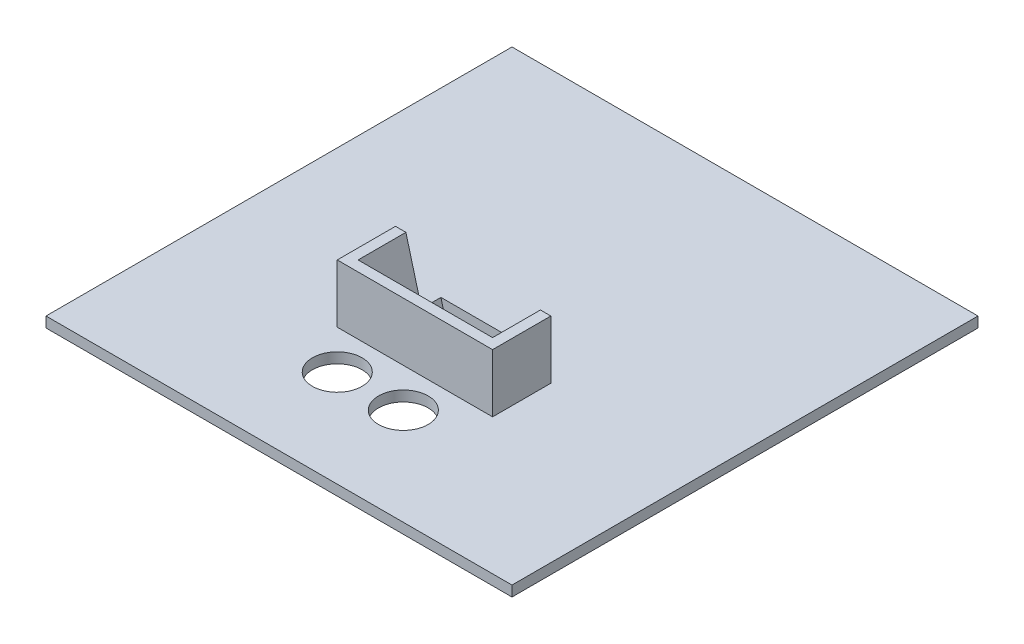
ISO-10303-21;
HEADER;
FILE_DESCRIPTION(('STEP AP214'),'2;1');
FILE_NAME('part.step','',(''),(''),'','','');
FILE_SCHEMA(('AUTOMOTIVE_DESIGN { 1 0 10303 214 1 1 1 1 }'));
ENDSEC;
DATA;
#1=APPLICATION_CONTEXT('core data for automotive mechanical design processes');
#2=APPLICATION_PROTOCOL_DEFINITION('international standard','automotive_design',2000,#1);
#3=PRODUCT_CONTEXT('',#1,'mechanical');
#4=PRODUCT('Part','Part','',(#3));
#5=PRODUCT_RELATED_PRODUCT_CATEGORY('part','',(#4));
#6=PRODUCT_DEFINITION_FORMATION('','',#4);
#7=PRODUCT_DEFINITION_CONTEXT('part definition',#1,'design');
#8=PRODUCT_DEFINITION('design','',#6,#7);
#9=PRODUCT_DEFINITION_SHAPE('','',#8);
#10=(LENGTH_UNIT() NAMED_UNIT(*) SI_UNIT(.MILLI.,.METRE.));
#11=(NAMED_UNIT(*) PLANE_ANGLE_UNIT() SI_UNIT($,.RADIAN.));
#12=(NAMED_UNIT(*) SI_UNIT($,.STERADIAN.) SOLID_ANGLE_UNIT());
#13=UNCERTAINTY_MEASURE_WITH_UNIT(LENGTH_MEASURE(1.E-05),#10,'distance_accuracy_value','');
#14=(GEOMETRIC_REPRESENTATION_CONTEXT(3) GLOBAL_UNCERTAINTY_ASSIGNED_CONTEXT((#13)) GLOBAL_UNIT_ASSIGNED_CONTEXT((#10,
#11,#12)) REPRESENTATION_CONTEXT('',''));
#15=CARTESIAN_POINT('',(0.,0.,0.));
#16=DIRECTION('',(0.,0.,1.));
#17=DIRECTION('',(1.,0.,0.));
#18=AXIS2_PLACEMENT_3D('',#15,#16,#17);
#19=CARTESIAN_POINT('',(50.8,22.4536,-63.5));
#20=DIRECTION('',(0.,0.,1.));
#21=DIRECTION('',(1.,0.,0.));
#22=AXIS2_PLACEMENT_3D('',#19,#20,#21);
#23=PLANE('',#22);
#24=DIRECTION('',(-1.,0.,0.));
#25=VECTOR('',#24,1.);
#26=CARTESIAN_POINT('',(50.8,22.4536,-63.5));
#27=LINE('',#26,#25);
#28=CARTESIAN_POINT('',(54.2036,22.4536,-63.5));
#29=VERTEX_POINT('',#28);
#30=CARTESIAN_POINT('',(50.8,22.4536,-63.5));
#31=VERTEX_POINT('',#30);
#32=EDGE_CURVE('E211',#29,#31,#27,.T.);
#33=ORIENTED_EDGE('',*,*,#32,.F.);
#34=DIRECTION('',(-0.258819045102521,0.965925826289068,0.));
#35=VECTOR('',#34,1.);
#36=CARTESIAN_POINT('',(53.9756020321603,23.3045,-63.5));
#37=LINE('',#36,#35);
#38=CARTESIAN_POINT('',(59.3080321158129,3.4036,-63.5));
#39=VERTEX_POINT('',#38);
#40=EDGE_CURVE('E176',#29,#39,#37,.F.);
#41=ORIENTED_EDGE('',*,*,#40,.T.);
#42=DIRECTION('',(-1.,0.,0.));
#43=VECTOR('',#42,1.);
#44=CARTESIAN_POINT('',(50.8,3.4036,-63.5));
#45=LINE('',#44,#43);
#46=CARTESIAN_POINT('',(50.8,3.4036,-63.5));
#47=VERTEX_POINT('',#46);
#48=EDGE_CURVE('E174',#39,#47,#45,.T.);
#49=ORIENTED_EDGE('',*,*,#48,.T.);
#50=DIRECTION('',(0.,-1.,0.));
#51=VECTOR('',#50,1.);
#52=CARTESIAN_POINT('',(50.8,22.4536,-63.5));
#53=LINE('',#52,#51);
#54=EDGE_CURVE('E210',#31,#47,#53,.T.);
#55=ORIENTED_EDGE('',*,*,#54,.F.);
#56=EDGE_LOOP('',(#33,#41,#49,#55));
#57=FACE_BOUND('',#56,.T.);
#58=ADVANCED_FACE('F45',(#57),#23,.F.);
#59=CARTESIAN_POINT('',(0.,3.4036,0.));
#60=DIRECTION('',(0.,-1.,0.));
#61=DIRECTION('',(0.,0.,-1.));
#62=AXIS2_PLACEMENT_3D('',#59,#60,#61);
#63=PLANE('',#62);
#64=DIRECTION('',(0.,0.,1.));
#65=VECTOR('',#64,1.);
#66=CARTESIAN_POINT('',(0.,3.4036,0.));
#67=LINE('',#66,#65);
#68=CARTESIAN_POINT('',(0.,3.4036,-152.4));
#69=VERTEX_POINT('',#68);
#70=CARTESIAN_POINT('',(0.,3.4036,0.));
#71=VERTEX_POINT('',#70);
#72=EDGE_CURVE('E262',#69,#71,#67,.T.);
#73=ORIENTED_EDGE('',*,*,#72,.T.);
#74=DIRECTION('',(1.,0.,0.));
#75=VECTOR('',#74,1.);
#76=CARTESIAN_POINT('',(0.,3.4036,0.));
#77=LINE('',#76,#75);
#78=CARTESIAN_POINT('',(152.4,3.4036,0.));
#79=VERTEX_POINT('',#78);
#80=EDGE_CURVE('E266',#71,#79,#77,.T.);
#81=ORIENTED_EDGE('',*,*,#80,.T.);
#82=DIRECTION('',(0.,0.,-1.));
#83=VECTOR('',#82,1.);
#84=CARTESIAN_POINT('',(152.4,3.4036,0.));
#85=LINE('',#84,#83);
#86=CARTESIAN_POINT('',(152.4,3.4036,-152.4));
#87=VERTEX_POINT('',#86);
#88=EDGE_CURVE('E270',#79,#87,#85,.T.);
#89=ORIENTED_EDGE('',*,*,#88,.T.);
#90=DIRECTION('',(-1.,0.,0.));
#91=VECTOR('',#90,1.);
#92=CARTESIAN_POINT('',(0.,3.4036,-152.4));
#93=LINE('',#92,#91);
#94=EDGE_CURVE('E273',#87,#69,#93,.T.);
#95=ORIENTED_EDGE('',*,*,#94,.T.);
#96=EDGE_LOOP('',(#73,#81,#89,#95));
#97=FACE_BOUND('',#96,.T.);
#98=CARTESIAN_POINT('',(85.1154,3.4036,-31.75));
#99=DIRECTION('',(0.,1.,0.));
#100=DIRECTION('',(0.,0.,1.));
#101=AXIS2_PLACEMENT_3D('',#98,#99,#100);
#102=CIRCLE('',#101,8.10895);
#103=CARTESIAN_POINT('',(85.1154,3.4036,-23.64105));
#104=VERTEX_POINT('',#103);
#105=EDGE_CURVE('E255',#104,#104,#102,.T.);
#106=ORIENTED_EDGE('',*,*,#105,.F.);
#107=EDGE_LOOP('',(#106));
#108=FACE_BOUND('',#107,.T.);
#109=CARTESIAN_POINT('',(63.5,3.4036,-31.75));
#110=DIRECTION('',(0.,1.,0.));
#111=DIRECTION('',(0.,0.,1.));
#112=AXIS2_PLACEMENT_3D('',#109,#110,#111);
#113=CIRCLE('',#112,8.10895);
#114=CARTESIAN_POINT('',(63.5,3.4036,-23.64105));
#115=VERTEX_POINT('',#114);
#116=EDGE_CURVE('E251',#115,#115,#113,.T.);
#117=ORIENTED_EDGE('',*,*,#116,.F.);
#118=EDGE_LOOP('',(#117));
#119=FACE_BOUND('',#118,.T.);
#120=ORIENTED_EDGE('',*,*,#48,.F.);
#121=DIRECTION('',(0.,0.,1.));
#122=VECTOR('',#121,1.);
#123=CARTESIAN_POINT('',(59.3080321158129,3.4036,0.));
#124=LINE('',#123,#122);
#125=CARTESIAN_POINT('',(59.3080321158129,3.4036,-69.85));
#126=VERTEX_POINT('',#125);
#127=EDGE_CURVE('E160',#39,#126,#124,.F.);
#128=ORIENTED_EDGE('',*,*,#127,.T.);
#129=DIRECTION('',(1.,0.,0.));
#130=VECTOR('',#129,1.);
#131=CARTESIAN_POINT('',(0.,3.4036,-69.85));
#132=LINE('',#131,#130);
#133=CARTESIAN_POINT('',(93.0919678841871,3.4036,-69.85));
#134=VERTEX_POINT('',#133);
#135=EDGE_CURVE('E149',#126,#134,#132,.T.);
#136=ORIENTED_EDGE('',*,*,#135,.T.);
#137=DIRECTION('',(0.,0.,-1.));
#138=VECTOR('',#137,1.);
#139=CARTESIAN_POINT('',(93.0919678841871,3.4036,0.));
#140=LINE('',#139,#138);
#141=CARTESIAN_POINT('',(93.0919678841871,3.4036,-63.5));
#142=VERTEX_POINT('',#141);
#143=EDGE_CURVE('E81',#134,#142,#140,.F.);
#144=ORIENTED_EDGE('',*,*,#143,.T.);
#145=CARTESIAN_POINT('',(101.6,3.4036,-63.5));
#146=VERTEX_POINT('',#145);
#147=EDGE_CURVE('E202',#146,#142,#45,.T.);
#148=ORIENTED_EDGE('',*,*,#147,.F.);
#149=DIRECTION('',(0.,0.,-1.));
#150=VECTOR('',#149,1.);
#151=CARTESIAN_POINT('',(101.6,3.4036,-44.45));
#152=LINE('',#151,#150);
#153=CARTESIAN_POINT('',(101.6,3.4036,-44.45));
#154=VERTEX_POINT('',#153);
#155=EDGE_CURVE('E228',#154,#146,#152,.T.);
#156=ORIENTED_EDGE('',*,*,#155,.F.);
#157=DIRECTION('',(1.,0.,0.));
#158=VECTOR('',#157,1.);
#159=CARTESIAN_POINT('',(50.8,3.4036,-44.45));
#160=LINE('',#159,#158);
#161=CARTESIAN_POINT('',(50.8,3.4036,-44.45));
#162=VERTEX_POINT('',#161);
#163=EDGE_CURVE('E224',#162,#154,#160,.T.);
#164=ORIENTED_EDGE('',*,*,#163,.F.);
#165=DIRECTION('',(0.,0.,1.));
#166=VECTOR('',#165,1.);
#167=CARTESIAN_POINT('',(50.8,3.4036,-44.45));
#168=LINE('',#167,#166);
#169=EDGE_CURVE('E159',#47,#162,#168,.T.);
#170=ORIENTED_EDGE('',*,*,#169,.F.);
#171=EDGE_LOOP('',(#120,#128,#136,#144,#148,#156,#164,#170));
#172=FACE_BOUND('',#171,.T.);
#173=ADVANCED_FACE('F172',(#97,#108,#119,#172),#63,.F.);
#174=CARTESIAN_POINT('',(0.,3.4036,0.));
#175=DIRECTION('',(1.,0.,0.));
#176=DIRECTION('',(0.,0.,-1.));
#177=AXIS2_PLACEMENT_3D('',#174,#175,#176);
#178=PLANE('',#177);
#179=DIRECTION('',(0.,0.,1.));
#180=VECTOR('',#179,1.);
#181=CARTESIAN_POINT('',(0.,0.,0.));
#182=LINE('',#181,#180);
#183=CARTESIAN_POINT('',(0.,0.,-152.4));
#184=VERTEX_POINT('',#183);
#185=CARTESIAN_POINT('',(0.,0.,0.));
#186=VERTEX_POINT('',#185);
#187=EDGE_CURVE('E250',#184,#186,#182,.T.);
#188=ORIENTED_EDGE('',*,*,#187,.T.);
#189=DIRECTION('',(0.,-1.,0.));
#190=VECTOR('',#189,1.);
#191=CARTESIAN_POINT('',(0.,3.4036,0.));
#192=LINE('',#191,#190);
#193=EDGE_CURVE('E56',#71,#186,#192,.T.);
#194=ORIENTED_EDGE('',*,*,#193,.F.);
#195=ORIENTED_EDGE('',*,*,#72,.F.);
#196=DIRECTION('',(0.,-1.,0.));
#197=VECTOR('',#196,1.);
#198=CARTESIAN_POINT('',(0.,3.4036,-152.4));
#199=LINE('',#198,#197);
#200=EDGE_CURVE('E276',#69,#184,#199,.T.);
#201=ORIENTED_EDGE('',*,*,#200,.T.);
#202=EDGE_LOOP('',(#188,#194,#195,#201));
#203=FACE_BOUND('',#202,.T.);
#204=ADVANCED_FACE('F352',(#203),#178,.F.);
#205=CARTESIAN_POINT('',(0.,3.4036,0.));
#206=DIRECTION('',(0.,0.,-1.));
#207=DIRECTION('',(-1.,0.,0.));
#208=AXIS2_PLACEMENT_3D('',#205,#206,#207);
#209=PLANE('',#208);
#210=DIRECTION('',(1.,0.,0.));
#211=VECTOR('',#210,1.);
#212=CARTESIAN_POINT('',(0.,0.,0.));
#213=LINE('',#212,#211);
#214=CARTESIAN_POINT('',(152.4,0.,0.));
#215=VERTEX_POINT('',#214);
#216=EDGE_CURVE('E280',#186,#215,#213,.T.);
#217=ORIENTED_EDGE('',*,*,#216,.T.);
#218=DIRECTION('',(0.,-1.,0.));
#219=VECTOR('',#218,1.);
#220=CARTESIAN_POINT('',(152.4,3.4036,0.));
#221=LINE('',#220,#219);
#222=EDGE_CURVE('E295',#79,#215,#221,.T.);
#223=ORIENTED_EDGE('',*,*,#222,.F.);
#224=ORIENTED_EDGE('',*,*,#80,.F.);
#225=ORIENTED_EDGE('',*,*,#193,.T.);
#226=EDGE_LOOP('',(#217,#223,#224,#225));
#227=FACE_BOUND('',#226,.T.);
#228=ADVANCED_FACE('F363',(#227),#209,.F.);
#229=CARTESIAN_POINT('',(152.4,3.4036,0.));
#230=DIRECTION('',(-1.,0.,0.));
#231=DIRECTION('',(0.,0.,1.));
#232=AXIS2_PLACEMENT_3D('',#229,#230,#231);
#233=PLANE('',#232);
#234=DIRECTION('',(0.,0.,-1.));
#235=VECTOR('',#234,1.);
#236=CARTESIAN_POINT('',(152.4,0.,0.));
#237=LINE('',#236,#235);
#238=CARTESIAN_POINT('',(152.4,0.,-152.4));
#239=VERTEX_POINT('',#238);
#240=EDGE_CURVE('E283',#215,#239,#237,.T.);
#241=ORIENTED_EDGE('',*,*,#240,.T.);
#242=DIRECTION('',(0.,-1.,0.));
#243=VECTOR('',#242,1.);
#244=CARTESIAN_POINT('',(152.4,3.4036,-152.4));
#245=LINE('',#244,#243);
#246=EDGE_CURVE('E291',#87,#239,#245,.T.);
#247=ORIENTED_EDGE('',*,*,#246,.F.);
#248=ORIENTED_EDGE('',*,*,#88,.F.);
#249=ORIENTED_EDGE('',*,*,#222,.T.);
#250=EDGE_LOOP('',(#241,#247,#248,#249));
#251=FACE_BOUND('',#250,.T.);
#252=ADVANCED_FACE('F360',(#251),#233,.F.);
#253=CARTESIAN_POINT('',(0.,3.4036,-152.4));
#254=DIRECTION('',(0.,0.,1.));
#255=DIRECTION('',(1.,0.,0.));
#256=AXIS2_PLACEMENT_3D('',#253,#254,#255);
#257=PLANE('',#256);
#258=DIRECTION('',(-1.,0.,0.));
#259=VECTOR('',#258,1.);
#260=CARTESIAN_POINT('',(0.,0.,-152.4));
#261=LINE('',#260,#259);
#262=EDGE_CURVE('E267',#239,#184,#261,.T.);
#263=ORIENTED_EDGE('',*,*,#262,.T.);
#264=ORIENTED_EDGE('',*,*,#200,.F.);
#265=ORIENTED_EDGE('',*,*,#94,.F.);
#266=ORIENTED_EDGE('',*,*,#246,.T.);
#267=EDGE_LOOP('',(#263,#264,#265,#266));
#268=FACE_BOUND('',#267,.T.);
#269=ADVANCED_FACE('F341',(#268),#257,.F.);
#270=CARTESIAN_POINT('',(0.,0.,0.));
#271=DIRECTION('',(0.,-1.,0.));
#272=DIRECTION('',(0.,0.,-1.));
#273=AXIS2_PLACEMENT_3D('',#270,#271,#272);
#274=PLANE('',#273);
#275=DIRECTION('',(0.,0.,-1.));
#276=VECTOR('',#275,1.);
#277=CARTESIAN_POINT('',(60.2200239871714,0.,0.));
#278=LINE('',#277,#276);
#279=CARTESIAN_POINT('',(60.2200239871714,0.,-69.85));
#280=VERTEX_POINT('',#279);
#281=CARTESIAN_POINT('',(60.2200239871714,0.,-53.8700239871715));
#282=VERTEX_POINT('',#281);
#283=EDGE_CURVE('E167',#280,#282,#278,.F.);
#284=ORIENTED_EDGE('',*,*,#283,.T.);
#285=DIRECTION('',(-1.,0.,0.));
#286=VECTOR('',#285,1.);
#287=CARTESIAN_POINT('',(54.2036,0.,-53.8700239871715));
#288=LINE('',#287,#286);
#289=CARTESIAN_POINT('',(92.1799760128286,0.,-53.8700239871715));
#290=VERTEX_POINT('',#289);
#291=EDGE_CURVE('E184',#282,#290,#288,.F.);
#292=ORIENTED_EDGE('',*,*,#291,.T.);
#293=DIRECTION('',(0.,0.,1.));
#294=VECTOR('',#293,1.);
#295=CARTESIAN_POINT('',(92.1799760128286,0.,-47.8536));
#296=LINE('',#295,#294);
#297=CARTESIAN_POINT('',(92.1799760128286,0.,-69.85));
#298=VERTEX_POINT('',#297);
#299=EDGE_CURVE('E65',#290,#298,#296,.F.);
#300=ORIENTED_EDGE('',*,*,#299,.T.);
#301=DIRECTION('',(-1.,0.,0.));
#302=VECTOR('',#301,1.);
#303=CARTESIAN_POINT('',(54.2036,0.,-69.85));
#304=LINE('',#303,#302);
#305=EDGE_CURVE('E190',#298,#280,#304,.T.);
#306=ORIENTED_EDGE('',*,*,#305,.T.);
#307=EDGE_LOOP('',(#284,#292,#300,#306));
#308=FACE_BOUND('',#307,.T.);
#309=CARTESIAN_POINT('',(63.5,0.,-31.75));
#310=DIRECTION('',(0.,1.,0.));
#311=DIRECTION('',(0.,0.,1.));
#312=AXIS2_PLACEMENT_3D('',#309,#310,#311);
#313=CIRCLE('',#312,8.10895);
#314=CARTESIAN_POINT('',(63.5,0.,-23.64105));
#315=VERTEX_POINT('',#314);
#316=EDGE_CURVE('E246',#315,#315,#313,.T.);
#317=ORIENTED_EDGE('',*,*,#316,.T.);
#318=EDGE_LOOP('',(#317));
#319=FACE_BOUND('',#318,.T.);
#320=CARTESIAN_POINT('',(85.1154,0.,-31.75));
#321=DIRECTION('',(0.,1.,0.));
#322=DIRECTION('',(0.,0.,1.));
#323=AXIS2_PLACEMENT_3D('',#320,#321,#322);
#324=CIRCLE('',#323,8.10895);
#325=CARTESIAN_POINT('',(85.1154,0.,-23.64105));
#326=VERTEX_POINT('',#325);
#327=EDGE_CURVE('E245',#326,#326,#324,.T.);
#328=ORIENTED_EDGE('',*,*,#327,.T.);
#329=EDGE_LOOP('',(#328));
#330=FACE_BOUND('',#329,.T.);
#331=ORIENTED_EDGE('',*,*,#187,.F.);
#332=ORIENTED_EDGE('',*,*,#262,.F.);
#333=ORIENTED_EDGE('',*,*,#240,.F.);
#334=ORIENTED_EDGE('',*,*,#216,.F.);
#335=EDGE_LOOP('',(#331,#332,#333,#334));
#336=FACE_BOUND('',#335,.T.);
#337=ADVANCED_FACE('F336',(#308,#319,#330,#336),#274,.T.);
#338=CARTESIAN_POINT('',(85.1154,0.,-31.75));
#339=DIRECTION('',(0.,1.,0.));
#340=DIRECTION('',(0.,0.,1.));
#341=AXIS2_PLACEMENT_3D('',#338,#339,#340);
#342=CYLINDRICAL_SURFACE('',#341,8.10895);
#343=ORIENTED_EDGE('',*,*,#327,.F.);
#344=EDGE_LOOP('',(#343));
#345=FACE_BOUND('',#344,.T.);
#346=ORIENTED_EDGE('',*,*,#105,.T.);
#347=EDGE_LOOP('',(#346));
#348=FACE_BOUND('',#347,.T.);
#349=ADVANCED_FACE('F340',(#345,#348),#342,.F.);
#350=CARTESIAN_POINT('',(63.5,0.,-31.75));
#351=DIRECTION('',(0.,1.,0.));
#352=DIRECTION('',(0.,0.,1.));
#353=AXIS2_PLACEMENT_3D('',#350,#351,#352);
#354=CYLINDRICAL_SURFACE('',#353,8.10895);
#355=ORIENTED_EDGE('',*,*,#316,.F.);
#356=EDGE_LOOP('',(#355));
#357=FACE_BOUND('',#356,.T.);
#358=ORIENTED_EDGE('',*,*,#116,.T.);
#359=EDGE_LOOP('',(#358));
#360=FACE_BOUND('',#359,.T.);
#361=ADVANCED_FACE('F372',(#357,#360),#354,.F.);
#362=CARTESIAN_POINT('',(50.8,22.4536,-44.45));
#363=DIRECTION('',(1.,0.,0.));
#364=DIRECTION('',(0.,0.,-1.));
#365=AXIS2_PLACEMENT_3D('',#362,#363,#364);
#366=PLANE('',#365);
#367=ORIENTED_EDGE('',*,*,#169,.T.);
#368=DIRECTION('',(0.,-1.,0.));
#369=VECTOR('',#368,1.);
#370=CARTESIAN_POINT('',(50.8,22.4536,-44.45));
#371=LINE('',#370,#369);
#372=CARTESIAN_POINT('',(50.8,22.4536,-44.45));
#373=VERTEX_POINT('',#372);
#374=EDGE_CURVE('E241',#373,#162,#371,.T.);
#375=ORIENTED_EDGE('',*,*,#374,.F.);
#376=DIRECTION('',(0.,0.,1.));
#377=VECTOR('',#376,1.);
#378=CARTESIAN_POINT('',(50.8,22.4536,-44.45));
#379=LINE('',#378,#377);
#380=EDGE_CURVE('E233',#31,#373,#379,.T.);
#381=ORIENTED_EDGE('',*,*,#380,.F.);
#382=ORIENTED_EDGE('',*,*,#54,.T.);
#383=EDGE_LOOP('',(#367,#375,#381,#382));
#384=FACE_BOUND('',#383,.T.);
#385=ADVANCED_FACE('F330',(#384),#366,.F.);
#386=CARTESIAN_POINT('',(50.8,22.4536,-44.45));
#387=DIRECTION('',(0.,0.,-1.));
#388=DIRECTION('',(-1.,0.,0.));
#389=AXIS2_PLACEMENT_3D('',#386,#387,#388);
#390=PLANE('',#389);
#391=ORIENTED_EDGE('',*,*,#163,.T.);
#392=DIRECTION('',(0.,-1.,0.));
#393=VECTOR('',#392,1.);
#394=CARTESIAN_POINT('',(101.6,22.4536,-44.45));
#395=LINE('',#394,#393);
#396=CARTESIAN_POINT('',(101.6,22.4536,-44.45));
#397=VERTEX_POINT('',#396);
#398=EDGE_CURVE('E237',#397,#154,#395,.T.);
#399=ORIENTED_EDGE('',*,*,#398,.F.);
#400=DIRECTION('',(1.,0.,0.));
#401=VECTOR('',#400,1.);
#402=CARTESIAN_POINT('',(50.8,22.4536,-44.45));
#403=LINE('',#402,#401);
#404=EDGE_CURVE('E319',#373,#397,#403,.T.);
#405=ORIENTED_EDGE('',*,*,#404,.F.);
#406=ORIENTED_EDGE('',*,*,#374,.T.);
#407=EDGE_LOOP('',(#391,#399,#405,#406));
#408=FACE_BOUND('',#407,.T.);
#409=ADVANCED_FACE('F326',(#408),#390,.F.);
#410=CARTESIAN_POINT('',(101.6,22.4536,-44.45));
#411=DIRECTION('',(-1.,0.,0.));
#412=DIRECTION('',(0.,0.,1.));
#413=AXIS2_PLACEMENT_3D('',#410,#411,#412);
#414=PLANE('',#413);
#415=ORIENTED_EDGE('',*,*,#155,.T.);
#416=DIRECTION('',(0.,-1.,0.));
#417=VECTOR('',#416,1.);
#418=CARTESIAN_POINT('',(101.6,22.4536,-63.5));
#419=LINE('',#418,#417);
#420=CARTESIAN_POINT('',(101.6,22.4536,-63.5));
#421=VERTEX_POINT('',#420);
#422=EDGE_CURVE('E216',#421,#146,#419,.T.);
#423=ORIENTED_EDGE('',*,*,#422,.F.);
#424=DIRECTION('',(0.,0.,-1.));
#425=VECTOR('',#424,1.);
#426=CARTESIAN_POINT('',(101.6,22.4536,-44.45));
#427=LINE('',#426,#425);
#428=EDGE_CURVE('E207',#397,#421,#427,.T.);
#429=ORIENTED_EDGE('',*,*,#428,.F.);
#430=ORIENTED_EDGE('',*,*,#398,.T.);
#431=EDGE_LOOP('',(#415,#423,#429,#430));
#432=FACE_BOUND('',#431,.T.);
#433=ADVANCED_FACE('F328',(#432),#414,.F.);
#434=ORIENTED_EDGE('',*,*,#147,.T.);
#435=DIRECTION('',(-0.258819045102521,-0.965925826289068,0.));
#436=VECTOR('',#435,1.);
#437=CARTESIAN_POINT('',(95.0214432239644,10.6045,-63.5));
#438=LINE('',#437,#436);
#439=CARTESIAN_POINT('',(98.1964,22.4536,-63.5));
#440=VERTEX_POINT('',#439);
#441=EDGE_CURVE('E49',#142,#440,#438,.F.);
#442=ORIENTED_EDGE('',*,*,#441,.T.);
#443=EDGE_CURVE('E201',#421,#440,#27,.T.);
#444=ORIENTED_EDGE('',*,*,#443,.F.);
#445=ORIENTED_EDGE('',*,*,#422,.T.);
#446=EDGE_LOOP('',(#434,#442,#444,#445));
#447=FACE_BOUND('',#446,.T.);
#448=ADVANCED_FACE('F199',(#447),#23,.F.);
#449=CARTESIAN_POINT('',(0.,22.4536,0.));
#450=DIRECTION('',(0.,-1.,0.));
#451=DIRECTION('',(0.,0.,-1.));
#452=AXIS2_PLACEMENT_3D('',#449,#450,#451);
#453=PLANE('',#452);
#454=DIRECTION('',(1.,0.,0.));
#455=VECTOR('',#454,1.);
#456=CARTESIAN_POINT('',(54.2036,22.4536,-47.8536));
#457=LINE('',#456,#455);
#458=CARTESIAN_POINT('',(54.2036,22.4536,-47.8536));
#459=VERTEX_POINT('',#458);
#460=CARTESIAN_POINT('',(98.1964,22.4536,-47.8536));
#461=VERTEX_POINT('',#460);
#462=EDGE_CURVE('E309',#459,#461,#457,.T.);
#463=ORIENTED_EDGE('',*,*,#462,.F.);
#464=DIRECTION('',(0.,0.,-1.));
#465=VECTOR('',#464,1.);
#466=CARTESIAN_POINT('',(54.2036,22.4536,0.));
#467=LINE('',#466,#465);
#468=EDGE_CURVE('E11',#459,#29,#467,.T.);
#469=ORIENTED_EDGE('',*,*,#468,.T.);
#470=ORIENTED_EDGE('',*,*,#32,.T.);
#471=ORIENTED_EDGE('',*,*,#380,.T.);
#472=ORIENTED_EDGE('',*,*,#404,.T.);
#473=ORIENTED_EDGE('',*,*,#428,.T.);
#474=ORIENTED_EDGE('',*,*,#443,.T.);
#475=DIRECTION('',(0.,0.,-1.));
#476=VECTOR('',#475,1.);
#477=CARTESIAN_POINT('',(98.1964,22.4536,-47.8536));
#478=LINE('',#477,#476);
#479=EDGE_CURVE('E87',#461,#440,#478,.T.);
#480=ORIENTED_EDGE('',*,*,#479,.F.);
#481=EDGE_LOOP('',(#463,#469,#470,#471,#472,#473,#474,#480));
#482=FACE_BOUND('',#481,.T.);
#483=ADVANCED_FACE('F205',(#482),#453,.F.);
#484=CARTESIAN_POINT('',(54.2036,0.,-69.85));
#485=DIRECTION('',(0.,0.,-1.));
#486=DIRECTION('',(-1.,0.,0.));
#487=AXIS2_PLACEMENT_3D('',#484,#485,#486);
#488=PLANE('',#487);
#489=DIRECTION('',(0.258819045102521,-0.965925826289068,0.));
#490=VECTOR('',#489,1.);
#491=CARTESIAN_POINT('',(59.817,1.50410599679287,-69.85));
#492=LINE('',#491,#490);
#493=EDGE_CURVE('E153',#280,#126,#492,.F.);
#494=ORIENTED_EDGE('',*,*,#493,.F.);
#495=ORIENTED_EDGE('',*,*,#305,.F.);
#496=DIRECTION('',(-0.258819045102521,-0.965925826289068,0.));
#497=VECTOR('',#496,1.);
#498=CARTESIAN_POINT('',(98.1964,22.4536,-69.85));
#499=LINE('',#498,#497);
#500=EDGE_CURVE('E155',#298,#134,#499,.F.);
#501=ORIENTED_EDGE('',*,*,#500,.T.);
#502=ORIENTED_EDGE('',*,*,#135,.F.);
#503=EDGE_LOOP('',(#494,#495,#501,#502));
#504=FACE_BOUND('',#503,.T.);
#505=ADVANCED_FACE('F151',(#504),#488,.F.);
#506=CARTESIAN_POINT('',(54.2036,22.4536,0.));
#507=DIRECTION('',(0.965925826289068,0.258819045102521,0.));
#508=DIRECTION('',(-0.258819045102521,0.965925826289068,0.));
#509=AXIS2_PLACEMENT_3D('',#506,#507,#508);
#510=PLANE('',#509);
#511=ORIENTED_EDGE('',*,*,#40,.F.);
#512=ORIENTED_EDGE('',*,*,#468,.F.);
#513=DIRECTION('',(-0.250562807085732,0.935113126531029,0.250562807085732));
#514=VECTOR('',#513,1.);
#515=CARTESIAN_POINT('',(51.1992686697064,33.6659171674266,-44.8492686697064));
#516=LINE('',#515,#514);
#517=EDGE_CURVE('E302',#282,#459,#516,.T.);
#518=ORIENTED_EDGE('',*,*,#517,.F.);
#519=ORIENTED_EDGE('',*,*,#283,.F.);
#520=ORIENTED_EDGE('',*,*,#493,.T.);
#521=ORIENTED_EDGE('',*,*,#127,.F.);
#522=EDGE_LOOP('',(#511,#512,#518,#519,#520,#521));
#523=FACE_BOUND('',#522,.T.);
#524=ADVANCED_FACE('F163',(#523),#510,.T.);
#525=CARTESIAN_POINT('',(98.1964,22.4536,-47.8536));
#526=DIRECTION('',(-0.965925826289068,0.258819045102521,0.));
#527=DIRECTION('',(-0.258819045102521,-0.965925826289068,0.));
#528=AXIS2_PLACEMENT_3D('',#525,#526,#527);
#529=PLANE('',#528);
#530=ORIENTED_EDGE('',*,*,#500,.F.);
#531=ORIENTED_EDGE('',*,*,#299,.F.);
#532=DIRECTION('',(0.250562807085732,0.935113126531029,0.250562807085732));
#533=VECTOR('',#532,1.);
#534=CARTESIAN_POINT('',(95.4344563354202,12.1458859161449,-50.6155436645799));
#535=LINE('',#534,#533);
#536=EDGE_CURVE('E192',#290,#461,#535,.T.);
#537=ORIENTED_EDGE('',*,*,#536,.T.);
#538=ORIENTED_EDGE('',*,*,#479,.T.);
#539=ORIENTED_EDGE('',*,*,#441,.F.);
#540=ORIENTED_EDGE('',*,*,#143,.F.);
#541=EDGE_LOOP('',(#530,#531,#537,#538,#539,#540));
#542=FACE_BOUND('',#541,.T.);
#543=ADVANCED_FACE('F306',(#542),#529,.T.);
#544=CARTESIAN_POINT('',(54.2036,22.4536,-47.8536));
#545=DIRECTION('',(0.,0.258819045102521,-0.965925826289068));
#546=DIRECTION('',(0.,0.965925826289068,0.258819045102521));
#547=AXIS2_PLACEMENT_3D('',#544,#545,#546);
#548=PLANE('',#547);
#549=ORIENTED_EDGE('',*,*,#462,.T.);
#550=ORIENTED_EDGE('',*,*,#536,.F.);
#551=ORIENTED_EDGE('',*,*,#291,.F.);
#552=ORIENTED_EDGE('',*,*,#517,.T.);
#553=EDGE_LOOP('',(#549,#550,#551,#552));
#554=FACE_BOUND('',#553,.T.);
#555=ADVANCED_FACE('F47',(#554),#548,.T.);
#556=CLOSED_SHELL('',(#58,#173,#204,#228,#252,#269,#337,#349,#361,#385,#409,#433,#448,#483,#505,
#524,#543,#555));
#557=MANIFOLD_SOLID_BREP('B2',#556);
#558=ADVANCED_BREP_SHAPE_REPRESENTATION('',(#18,#557),#14);
#559=SHAPE_DEFINITION_REPRESENTATION(#9,#558);
ENDSEC;
END-ISO-10303-21;
